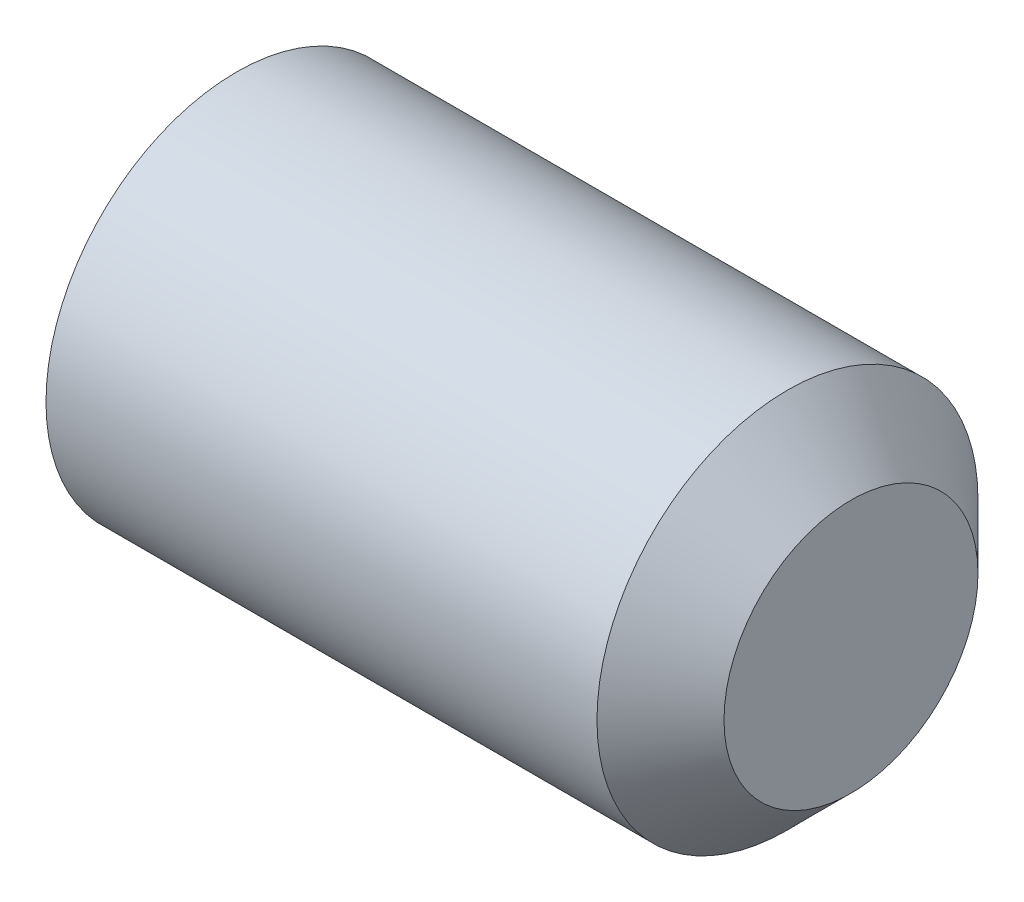
ISO-10303-21;
HEADER;
FILE_DESCRIPTION(('STEP AP214'),'2;1');
FILE_NAME('part.step','',(''),(''),'','','');
FILE_SCHEMA(('AUTOMOTIVE_DESIGN { 1 0 10303 214 1 1 1 1 }'));
ENDSEC;
DATA;
#1=APPLICATION_CONTEXT('core data for automotive mechanical design processes');
#2=APPLICATION_PROTOCOL_DEFINITION('international standard','automotive_design',2000,#1);
#3=PRODUCT_CONTEXT('',#1,'mechanical');
#4=PRODUCT('Part','Part','',(#3));
#5=PRODUCT_RELATED_PRODUCT_CATEGORY('part','',(#4));
#6=PRODUCT_DEFINITION_FORMATION('','',#4);
#7=PRODUCT_DEFINITION_CONTEXT('part definition',#1,'design');
#8=PRODUCT_DEFINITION('design','',#6,#7);
#9=PRODUCT_DEFINITION_SHAPE('','',#8);
#10=(LENGTH_UNIT() NAMED_UNIT(*) SI_UNIT(.MILLI.,.METRE.));
#11=(NAMED_UNIT(*) PLANE_ANGLE_UNIT() SI_UNIT($,.RADIAN.));
#12=(NAMED_UNIT(*) SI_UNIT($,.STERADIAN.) SOLID_ANGLE_UNIT());
#13=UNCERTAINTY_MEASURE_WITH_UNIT(LENGTH_MEASURE(1.E-05),#10,'distance_accuracy_value','');
#14=(GEOMETRIC_REPRESENTATION_CONTEXT(3) GLOBAL_UNCERTAINTY_ASSIGNED_CONTEXT((#13)) GLOBAL_UNIT_ASSIGNED_CONTEXT((#10,
#11,#12)) REPRESENTATION_CONTEXT('',''));
#15=CARTESIAN_POINT('',(0.,0.,0.));
#16=DIRECTION('',(0.,0.,1.));
#17=DIRECTION('',(1.,0.,0.));
#18=AXIS2_PLACEMENT_3D('',#15,#16,#17);
#19=CARTESIAN_POINT('',(5.,0.,0.));
#20=DIRECTION('',(-1.,0.,0.));
#21=DIRECTION('',(0.,0.,1.));
#22=AXIS2_PLACEMENT_3D('',#19,#20,#21);
#23=CYLINDRICAL_SURFACE('',#22,1.5);
#24=CARTESIAN_POINT('',(0.161946750507689,0.,0.));
#25=DIRECTION('',(-1.,0.,0.));
#26=DIRECTION('',(0.,0.,1.));
#27=AXIS2_PLACEMENT_3D('',#24,#25,#26);
#28=CIRCLE('',#27,1.5);
#29=CARTESIAN_POINT('',(0.161946750507689,0.,-1.5));
#30=VERTEX_POINT('',#29);
#31=EDGE_CURVE('E11',#30,#30,#28,.F.);
#32=ORIENTED_EDGE('',*,*,#31,.T.);
#33=EDGE_LOOP('',(#32));
#34=FACE_BOUND('',#33,.T.);
#35=CARTESIAN_POINT('',(4.5,0.,0.));
#36=DIRECTION('',(1.,0.,0.));
#37=DIRECTION('',(0.,0.,-1.));
#38=AXIS2_PLACEMENT_3D('',#35,#36,#37);
#39=CIRCLE('',#38,1.5);
#40=CARTESIAN_POINT('',(4.5,0.,-1.5));
#41=VERTEX_POINT('',#40);
#42=EDGE_CURVE('E137',#41,#41,#39,.F.);
#43=ORIENTED_EDGE('',*,*,#42,.T.);
#44=EDGE_LOOP('',(#43));
#45=FACE_BOUND('',#44,.T.);
#46=ADVANCED_FACE('F35',(#34,#45),#23,.T.);
#47=CARTESIAN_POINT('',(5.,1.5,0.));
#48=DIRECTION('',(1.,0.,0.));
#49=DIRECTION('',(0.,0.,-1.));
#50=AXIS2_PLACEMENT_3D('',#47,#48,#49);
#51=PLANE('',#50);
#52=CARTESIAN_POINT('',(5.,0.,0.));
#53=DIRECTION('',(1.,0.,0.));
#54=DIRECTION('',(0.,0.,-1.));
#55=AXIS2_PLACEMENT_3D('',#52,#53,#54);
#56=CIRCLE('',#55,1.);
#57=CARTESIAN_POINT('',(5.,0.,-1.));
#58=VERTEX_POINT('',#57);
#59=EDGE_CURVE('E145',#58,#58,#56,.T.);
#60=ORIENTED_EDGE('',*,*,#59,.T.);
#61=EDGE_LOOP('',(#60));
#62=FACE_BOUND('',#61,.T.);
#63=ADVANCED_FACE('F162',(#62),#51,.T.);
#64=CARTESIAN_POINT('',(0.,0.,0.));
#65=DIRECTION('',(-1.,0.,0.));
#66=DIRECTION('',(0.,0.,1.));
#67=AXIS2_PLACEMENT_3D('',#64,#65,#66);
#68=PLANE('',#67);
#69=CARTESIAN_POINT('',(0.,0.,0.));
#70=DIRECTION('',(-1.,0.,0.));
#71=DIRECTION('',(0.,0.,1.));
#72=AXIS2_PLACEMENT_3D('',#69,#70,#71);
#73=CIRCLE('',#72,1.2195);
#74=CARTESIAN_POINT('',(0.,0.,-1.2195));
#75=VERTEX_POINT('',#74);
#76=EDGE_CURVE('E43',#75,#75,#73,.T.);
#77=ORIENTED_EDGE('',*,*,#76,.T.);
#78=EDGE_LOOP('',(#77));
#79=FACE_BOUND('',#78,.T.);
#80=DIRECTION('',(0.,0.,1.));
#81=VECTOR('',#80,1.);
#82=CARTESIAN_POINT('',(0.,-0.75,-0.433012701892222));
#83=LINE('',#82,#81);
#84=CARTESIAN_POINT('',(0.,-0.75,-0.433012701892222));
#85=VERTEX_POINT('',#84);
#86=CARTESIAN_POINT('',(0.,-0.75,0.433012701892217));
#87=VERTEX_POINT('',#86);
#88=EDGE_CURVE('E50',#85,#87,#83,.T.);
#89=ORIENTED_EDGE('',*,*,#88,.F.);
#90=DIRECTION('',(0.,-0.86602540378444,0.499999999999999));
#91=VECTOR('',#90,1.);
#92=CARTESIAN_POINT('',(0.,0.,-0.866025403784441));
#93=LINE('',#92,#91);
#94=CARTESIAN_POINT('',(0.,0.,-0.866025403784441));
#95=VERTEX_POINT('',#94);
#96=EDGE_CURVE('E133',#95,#85,#93,.T.);
#97=ORIENTED_EDGE('',*,*,#96,.F.);
#98=DIRECTION('',(0.,-0.866025403784438,-0.500000000000002));
#99=VECTOR('',#98,1.);
#100=CARTESIAN_POINT('',(0.,0.75,-0.433012701892222));
#101=LINE('',#100,#99);
#102=CARTESIAN_POINT('',(0.,0.75,-0.433012701892222));
#103=VERTEX_POINT('',#102);
#104=EDGE_CURVE('E131',#103,#95,#101,.T.);
#105=ORIENTED_EDGE('',*,*,#104,.F.);
#106=DIRECTION('',(0.,0.,-1.));
#107=VECTOR('',#106,1.);
#108=CARTESIAN_POINT('',(0.,0.75,0.433012701892217));
#109=LINE('',#108,#107);
#110=CARTESIAN_POINT('',(0.,0.75,0.433012701892217));
#111=VERTEX_POINT('',#110);
#112=EDGE_CURVE('E98',#111,#103,#109,.T.);
#113=ORIENTED_EDGE('',*,*,#112,.F.);
#114=DIRECTION('',(0.,0.866025403784438,-0.500000000000001));
#115=VECTOR('',#114,1.);
#116=CARTESIAN_POINT('',(0.,0.,0.866025403784436));
#117=LINE('',#116,#115);
#118=CARTESIAN_POINT('',(0.,0.,0.866025403784436));
#119=VERTEX_POINT('',#118);
#120=EDGE_CURVE('E127',#119,#111,#117,.T.);
#121=ORIENTED_EDGE('',*,*,#120,.F.);
#122=DIRECTION('',(0.,0.86602540378444,0.499999999999998));
#123=VECTOR('',#122,1.);
#124=CARTESIAN_POINT('',(0.,-0.75,0.433012701892217));
#125=LINE('',#124,#123);
#126=EDGE_CURVE('E124',#87,#119,#125,.T.);
#127=ORIENTED_EDGE('',*,*,#126,.F.);
#128=EDGE_LOOP('',(#89,#97,#105,#113,#121,#127));
#129=FACE_BOUND('',#128,.T.);
#130=ADVANCED_FACE('F150',(#79,#129),#68,.T.);
#131=CARTESIAN_POINT('',(2.,-0.75,-0.433012701892222));
#132=DIRECTION('',(0.,-1.,0.));
#133=DIRECTION('',(0.,0.,-1.));
#134=AXIS2_PLACEMENT_3D('',#131,#132,#133);
#135=PLANE('',#134);
#136=ORIENTED_EDGE('',*,*,#88,.T.);
#137=DIRECTION('',(-1.,0.,0.));
#138=VECTOR('',#137,1.);
#139=CARTESIAN_POINT('',(2.,-0.75,0.433012701892217));
#140=LINE('',#139,#138);
#141=CARTESIAN_POINT('',(2.,-0.75,0.433012701892217));
#142=VERTEX_POINT('',#141);
#143=EDGE_CURVE('E80',#142,#87,#140,.T.);
#144=ORIENTED_EDGE('',*,*,#143,.F.);
#145=DIRECTION('',(0.,0.,1.));
#146=VECTOR('',#145,1.);
#147=CARTESIAN_POINT('',(2.,-0.75,-0.433012701892222));
#148=LINE('',#147,#146);
#149=CARTESIAN_POINT('',(2.,-0.75,-0.433012701892222));
#150=VERTEX_POINT('',#149);
#151=EDGE_CURVE('E135',#150,#142,#148,.T.);
#152=ORIENTED_EDGE('',*,*,#151,.F.);
#153=DIRECTION('',(-1.,0.,0.));
#154=VECTOR('',#153,1.);
#155=CARTESIAN_POINT('',(2.,-0.75,-0.433012701892222));
#156=LINE('',#155,#154);
#157=EDGE_CURVE('E58',#150,#85,#156,.T.);
#158=ORIENTED_EDGE('',*,*,#157,.T.);
#159=EDGE_LOOP('',(#136,#144,#152,#158));
#160=FACE_BOUND('',#159,.T.);
#161=ADVANCED_FACE('F174',(#160),#135,.F.);
#162=CARTESIAN_POINT('',(2.,0.,-0.866025403784441));
#163=DIRECTION('',(0.,-0.499999999999999,-0.86602540378444));
#164=DIRECTION('',(0.,0.866025403784439,-0.499999999999998));
#165=AXIS2_PLACEMENT_3D('',#162,#163,#164);
#166=PLANE('',#165);
#167=ORIENTED_EDGE('',*,*,#96,.T.);
#168=ORIENTED_EDGE('',*,*,#157,.F.);
#169=DIRECTION('',(0.,-0.86602540378444,0.499999999999999));
#170=VECTOR('',#169,1.);
#171=CARTESIAN_POINT('',(2.,0.,-0.866025403784441));
#172=LINE('',#171,#170);
#173=CARTESIAN_POINT('',(2.,0.,-0.866025403784441));
#174=VERTEX_POINT('',#173);
#175=EDGE_CURVE('E110',#174,#150,#172,.T.);
#176=ORIENTED_EDGE('',*,*,#175,.F.);
#177=DIRECTION('',(-1.,0.,0.));
#178=VECTOR('',#177,1.);
#179=CARTESIAN_POINT('',(2.,0.,-0.866025403784441));
#180=LINE('',#179,#178);
#181=EDGE_CURVE('E102',#174,#95,#180,.T.);
#182=ORIENTED_EDGE('',*,*,#181,.T.);
#183=EDGE_LOOP('',(#167,#168,#176,#182));
#184=FACE_BOUND('',#183,.T.);
#185=ADVANCED_FACE('F177',(#184),#166,.F.);
#186=CARTESIAN_POINT('',(2.,0.75,-0.433012701892222));
#187=DIRECTION('',(0.,0.500000000000002,-0.866025403784438));
#188=DIRECTION('',(0.,0.866025403784438,0.500000000000002));
#189=AXIS2_PLACEMENT_3D('',#186,#187,#188);
#190=PLANE('',#189);
#191=ORIENTED_EDGE('',*,*,#104,.T.);
#192=ORIENTED_EDGE('',*,*,#181,.F.);
#193=DIRECTION('',(0.,-0.866025403784438,-0.500000000000002));
#194=VECTOR('',#193,1.);
#195=CARTESIAN_POINT('',(2.,0.75,-0.433012701892222));
#196=LINE('',#195,#194);
#197=CARTESIAN_POINT('',(2.,0.75,-0.433012701892222));
#198=VERTEX_POINT('',#197);
#199=EDGE_CURVE('E106',#198,#174,#196,.T.);
#200=ORIENTED_EDGE('',*,*,#199,.F.);
#201=DIRECTION('',(-1.,0.,0.));
#202=VECTOR('',#201,1.);
#203=CARTESIAN_POINT('',(2.,0.75,-0.433012701892222));
#204=LINE('',#203,#202);
#205=EDGE_CURVE('E91',#198,#103,#204,.T.);
#206=ORIENTED_EDGE('',*,*,#205,.T.);
#207=EDGE_LOOP('',(#191,#192,#200,#206));
#208=FACE_BOUND('',#207,.T.);
#209=ADVANCED_FACE('F107',(#208),#190,.F.);
#210=CARTESIAN_POINT('',(2.,0.75,0.433012701892217));
#211=DIRECTION('',(0.,1.,0.));
#212=DIRECTION('',(0.,0.,1.));
#213=AXIS2_PLACEMENT_3D('',#210,#211,#212);
#214=PLANE('',#213);
#215=ORIENTED_EDGE('',*,*,#112,.T.);
#216=ORIENTED_EDGE('',*,*,#205,.F.);
#217=DIRECTION('',(0.,0.,-1.));
#218=VECTOR('',#217,1.);
#219=CARTESIAN_POINT('',(2.,0.75,0.433012701892217));
#220=LINE('',#219,#218);
#221=CARTESIAN_POINT('',(2.,0.75,0.433012701892217));
#222=VERTEX_POINT('',#221);
#223=EDGE_CURVE('E95',#222,#198,#220,.T.);
#224=ORIENTED_EDGE('',*,*,#223,.F.);
#225=DIRECTION('',(-1.,0.,0.));
#226=VECTOR('',#225,1.);
#227=CARTESIAN_POINT('',(2.,0.75,0.433012701892217));
#228=LINE('',#227,#226);
#229=EDGE_CURVE('E103',#222,#111,#228,.T.);
#230=ORIENTED_EDGE('',*,*,#229,.T.);
#231=EDGE_LOOP('',(#215,#216,#224,#230));
#232=FACE_BOUND('',#231,.T.);
#233=ADVANCED_FACE('F93',(#232),#214,.F.);
#234=CARTESIAN_POINT('',(2.,0.,0.866025403784436));
#235=DIRECTION('',(0.,0.500000000000001,0.866025403784438));
#236=DIRECTION('',(0.,-0.866025403784438,0.500000000000001));
#237=AXIS2_PLACEMENT_3D('',#234,#235,#236);
#238=PLANE('',#237);
#239=ORIENTED_EDGE('',*,*,#120,.T.);
#240=ORIENTED_EDGE('',*,*,#229,.F.);
#241=DIRECTION('',(0.,0.866025403784438,-0.500000000000001));
#242=VECTOR('',#241,1.);
#243=CARTESIAN_POINT('',(2.,0.,0.866025403784436));
#244=LINE('',#243,#242);
#245=CARTESIAN_POINT('',(2.,0.,0.866025403784436));
#246=VERTEX_POINT('',#245);
#247=EDGE_CURVE('E116',#246,#222,#244,.T.);
#248=ORIENTED_EDGE('',*,*,#247,.F.);
#249=DIRECTION('',(-1.,0.,0.));
#250=VECTOR('',#249,1.);
#251=CARTESIAN_POINT('',(2.,0.,0.866025403784436));
#252=LINE('',#251,#250);
#253=EDGE_CURVE('E140',#246,#119,#252,.T.);
#254=ORIENTED_EDGE('',*,*,#253,.T.);
#255=EDGE_LOOP('',(#239,#240,#248,#254));
#256=FACE_BOUND('',#255,.T.);
#257=ADVANCED_FACE('F181',(#256),#238,.F.);
#258=CARTESIAN_POINT('',(2.,-0.75,0.433012701892217));
#259=DIRECTION('',(0.,-0.499999999999998,0.86602540378444));
#260=DIRECTION('',(0.,-0.86602540378444,-0.499999999999998));
#261=AXIS2_PLACEMENT_3D('',#258,#259,#260);
#262=PLANE('',#261);
#263=ORIENTED_EDGE('',*,*,#126,.T.);
#264=ORIENTED_EDGE('',*,*,#253,.F.);
#265=DIRECTION('',(0.,0.86602540378444,0.499999999999998));
#266=VECTOR('',#265,1.);
#267=CARTESIAN_POINT('',(2.,-0.75,0.433012701892217));
#268=LINE('',#267,#266);
#269=EDGE_CURVE('E118',#142,#246,#268,.T.);
#270=ORIENTED_EDGE('',*,*,#269,.F.);
#271=ORIENTED_EDGE('',*,*,#143,.T.);
#272=EDGE_LOOP('',(#263,#264,#270,#271));
#273=FACE_BOUND('',#272,.T.);
#274=ADVANCED_FACE('F178',(#273),#262,.F.);
#275=CARTESIAN_POINT('',(2.,0.,0.));
#276=DIRECTION('',(-1.,0.,0.));
#277=DIRECTION('',(0.,0.,1.));
#278=AXIS2_PLACEMENT_3D('',#275,#276,#277);
#279=PLANE('',#278);
#280=ORIENTED_EDGE('',*,*,#151,.T.);
#281=ORIENTED_EDGE('',*,*,#269,.T.);
#282=ORIENTED_EDGE('',*,*,#247,.T.);
#283=ORIENTED_EDGE('',*,*,#223,.T.);
#284=ORIENTED_EDGE('',*,*,#199,.T.);
#285=ORIENTED_EDGE('',*,*,#175,.T.);
#286=EDGE_LOOP('',(#280,#281,#282,#283,#284,#285));
#287=FACE_BOUND('',#286,.T.);
#288=ADVANCED_FACE('F113',(#287),#279,.T.);
#289=CARTESIAN_POINT('',(4.5,0.,0.));
#290=DIRECTION('',(-1.,0.,0.));
#291=DIRECTION('',(0.,0.,1.));
#292=AXIS2_PLACEMENT_3D('',#289,#290,#291);
#293=CONICAL_SURFACE('',#292,1.5,0.785398163397448);
#294=ORIENTED_EDGE('',*,*,#59,.F.);
#295=EDGE_LOOP('',(#294));
#296=FACE_BOUND('',#295,.T.);
#297=ORIENTED_EDGE('',*,*,#42,.F.);
#298=EDGE_LOOP('',(#297));
#299=FACE_BOUND('',#298,.T.);
#300=ADVANCED_FACE('F154',(#296,#299),#293,.T.);
#301=CARTESIAN_POINT('',(0.,0.,0.));
#302=DIRECTION('',(1.,0.,0.));
#303=DIRECTION('',(0.,0.,-1.));
#304=AXIS2_PLACEMENT_3D('',#301,#302,#303);
#305=CONICAL_SURFACE('',#304,1.2195,1.0471975511966);
#306=CARTESIAN_POINT('',(0.161946750507689,0.,-1.5));
#307=CARTESIAN_POINT('',(0.1602598051899,0.,-1.497078125));
#308=CARTESIAN_POINT('',(0.158572859872112,0.,-1.49415625));
#309=CARTESIAN_POINT('',(0.155198969236535,0.,-1.4883125));
#310=CARTESIAN_POINT('',(0.153512023918747,0.,-1.485390625));
#311=CARTESIAN_POINT('',(0.15013813328317,0.,-1.479546875));
#312=CARTESIAN_POINT('',(0.148451187965381,0.,-1.476625));
#313=CARTESIAN_POINT('',(0.145077297329804,0.,-1.47078125));
#314=CARTESIAN_POINT('',(0.143390352012016,0.,-1.467859375));
#315=CARTESIAN_POINT('',(0.140016461376439,0.,-1.462015625));
#316=CARTESIAN_POINT('',(0.138329516058651,0.,-1.45909375));
#317=CARTESIAN_POINT('',(0.134955625423074,0.,-1.45325));
#318=CARTESIAN_POINT('',(0.133268680105285,0.,-1.450328125));
#319=CARTESIAN_POINT('',(0.129894789469709,0.,-1.444484375));
#320=CARTESIAN_POINT('',(0.12820784415192,0.,-1.4415625));
#321=CARTESIAN_POINT('',(0.124833953516343,0.,-1.43571875));
#322=CARTESIAN_POINT('',(0.123147008198555,0.,-1.432796875));
#323=CARTESIAN_POINT('',(0.119773117562978,0.,-1.426953125));
#324=CARTESIAN_POINT('',(0.11808617224519,0.,-1.42403125));
#325=CARTESIAN_POINT('',(0.114712281609613,0.,-1.4181875));
#326=CARTESIAN_POINT('',(0.113025336291824,0.,-1.415265625));
#327=CARTESIAN_POINT('',(0.109651445656248,0.,-1.409421875));
#328=CARTESIAN_POINT('',(0.107964500338459,0.,-1.4065));
#329=CARTESIAN_POINT('',(0.104590609702882,0.,-1.40065625));
#330=CARTESIAN_POINT('',(0.102903664385094,0.,-1.397734375));
#331=CARTESIAN_POINT('',(0.099529773749517,0.,-1.391890625));
#332=CARTESIAN_POINT('',(0.0978428284317286,0.,-1.38896875));
#333=CARTESIAN_POINT('',(0.0944689377961518,0.,-1.383125));
#334=CARTESIAN_POINT('',(0.0927819924783633,0.,-1.380203125));
#335=CARTESIAN_POINT('',(0.0894081018427865,0.,-1.374359375));
#336=CARTESIAN_POINT('',(0.0877211565249981,0.,-1.3714375));
#337=CARTESIAN_POINT('',(0.0843472658894212,0.,-1.36559375));
#338=CARTESIAN_POINT('',(0.0826603205716328,0.,-1.362671875));
#339=CARTESIAN_POINT('',(0.0792864299360559,0.,-1.356828125));
#340=CARTESIAN_POINT('',(0.0775994846182676,0.,-1.35390625));
#341=CARTESIAN_POINT('',(0.0742255939826907,0.,-1.3480625));
#342=CARTESIAN_POINT('',(0.0725386486649022,0.,-1.345140625));
#343=CARTESIAN_POINT('',(0.0691647580293254,0.,-1.339296875));
#344=CARTESIAN_POINT('',(0.067477812711537,0.,-1.336375));
#345=CARTESIAN_POINT('',(0.0641039220759602,0.,-1.33053125));
#346=CARTESIAN_POINT('',(0.0624169767581717,0.,-1.327609375));
#347=CARTESIAN_POINT('',(0.0590430861225949,0.,-1.321765625));
#348=CARTESIAN_POINT('',(0.0573561408048065,0.,-1.31884375));
#349=CARTESIAN_POINT('',(0.0539822501692296,0.,-1.313));
#350=CARTESIAN_POINT('',(0.0522953048514412,0.,-1.310078125));
#351=CARTESIAN_POINT('',(0.0489214142158644,0.,-1.304234375));
#352=CARTESIAN_POINT('',(0.0472344688980759,0.,-1.3013125));
#353=CARTESIAN_POINT('',(0.0438605782624991,0.,-1.29546875));
#354=CARTESIAN_POINT('',(0.0421736329447107,0.,-1.292546875));
#355=CARTESIAN_POINT('',(0.0387997423091338,0.,-1.286703125));
#356=CARTESIAN_POINT('',(0.0371127969913454,0.,-1.28378125));
#357=CARTESIAN_POINT('',(0.0337389063557685,0.,-1.2779375));
#358=CARTESIAN_POINT('',(0.0320519610379802,0.,-1.275015625));
#359=CARTESIAN_POINT('',(0.0286780704024033,0.,-1.269171875));
#360=CARTESIAN_POINT('',(0.0269911250846149,0.,-1.26625));
#361=CARTESIAN_POINT('',(0.023617234449038,0.,-1.26040625));
#362=CARTESIAN_POINT('',(0.0219302891312496,0.,-1.257484375));
#363=CARTESIAN_POINT('',(0.0185563984956728,0.,-1.251640625));
#364=CARTESIAN_POINT('',(0.0168694531778843,0.,-1.24871875));
#365=CARTESIAN_POINT('',(0.0134955625423075,0.,-1.242875));
#366=CARTESIAN_POINT('',(0.0118086172245191,0.,-1.239953125));
#367=CARTESIAN_POINT('',(0.00843472658894227,0.,-1.234109375));
#368=CARTESIAN_POINT('',(0.00674778127115383,0.,-1.2311875));
#369=CARTESIAN_POINT('',(0.00337389063557695,0.,-1.22534375));
#370=CARTESIAN_POINT('',(0.0016869453177885,0.,-1.222421875));
#371=CARTESIAN_POINT('',(0.,0.,-1.2195));
#372=B_SPLINE_CURVE_WITH_KNOTS('',3,(#306,#307,#308,#309,#310,#311,#312,#313,#314,#315,#316,
#317,#318,#319,#320,#321,#322,#323,#324,#325,#326,#327,#328,#329,#330,#331,#332,#333,#334,#335,
#336,#337,#338,#339,#340,#341,#342,#343,#344,#345,#346,#347,#348,#349,#350,#351,#352,#353,#354,
#355,#356,#357,#358,#359,#360,#361,#362,#363,#364,#365,#366,#367,#368,#369,#370,#371),
.UNSPECIFIED.,.F.,.F.,(4,2,2,2,2,2,2,2,2,2,2,2,2,2,2,2,2,2,2,2,2,2,2,2,2,2,2,2,2,2,2,2,4),(0.,
0.0101216719067305,0.0202433438134612,0.0303650157201917,0.0404866876269224,0.0506083595336529,
0.0607300314403836,0.070851703347114,0.0809733752538447,0.0910950471605754,0.101216719067306,
0.111338390974037,0.121460062880767,0.131581734787498,0.141703406694228,0.151825078600959,
0.161946750507689,0.17206842241442,0.182190094321151,0.192311766227881,0.202433438134612,
0.212555110041342,0.222676781948073,0.232798453854804,0.242920125761534,0.253041797668265,
0.263163469574995,0.273285141481726,0.283406813388457,0.293528485295187,0.303650157201918,
0.313771829108648,0.323893501015379),.UNSPECIFIED.);
#373=EDGE_CURVE('BSEAM37',#30,#75,#372,.T.);
#374=ORIENTED_EDGE('',*,*,#31,.F.);
#375=ORIENTED_EDGE('',*,*,#76,.F.);
#376=ORIENTED_EDGE('',*,*,#373,.T.);
#377=ORIENTED_EDGE('',*,*,#373,.F.);
#378=EDGE_LOOP('',(#374,#376,#375,#377));
#379=FACE_BOUND('',#378,.T.);
#380=ADVANCED_FACE('F37',(#379),#305,.T.);
#381=CLOSED_SHELL('',(#46,#63,#130,#161,#185,#209,#233,#257,#274,#288,#300,#380));
#382=MANIFOLD_SOLID_BREP('B2',#381);
#383=ADVANCED_BREP_SHAPE_REPRESENTATION('',(#18,#382),#14);
#384=SHAPE_DEFINITION_REPRESENTATION(#9,#383);
ENDSEC;
END-ISO-10303-21;
